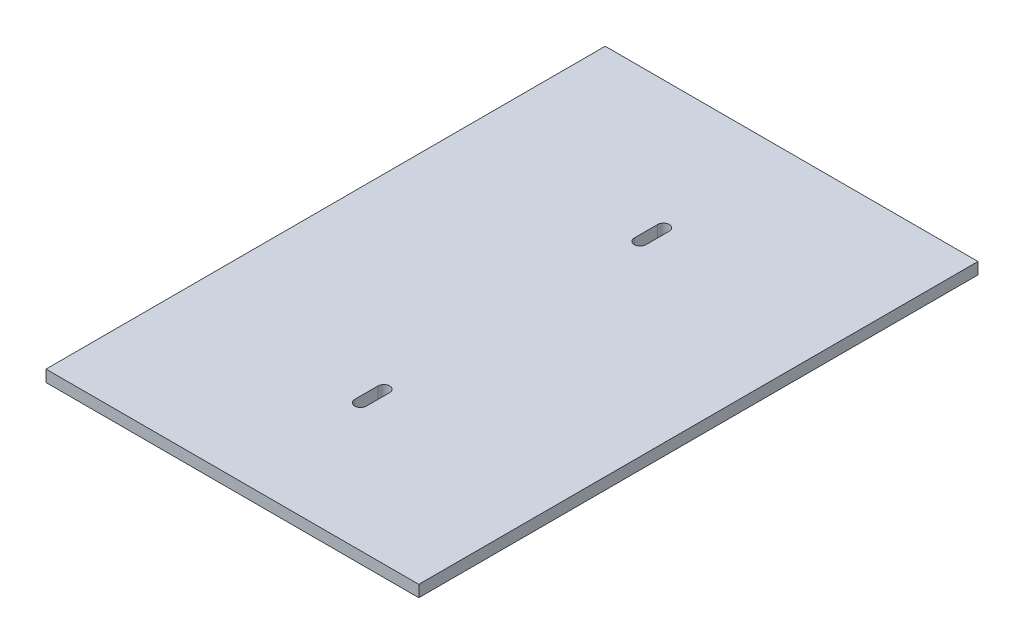
ISO-10303-21;
HEADER;
FILE_DESCRIPTION(('STEP AP214'),'2;1');
FILE_NAME('part.step','',(''),(''),'','','');
FILE_SCHEMA(('AUTOMOTIVE_DESIGN { 1 0 10303 214 1 1 1 1 }'));
ENDSEC;
DATA;
#1=APPLICATION_CONTEXT('core data for automotive mechanical design processes');
#2=APPLICATION_PROTOCOL_DEFINITION('international standard','automotive_design',2000,#1);
#3=PRODUCT_CONTEXT('',#1,'mechanical');
#4=PRODUCT('Part','Part','',(#3));
#5=PRODUCT_RELATED_PRODUCT_CATEGORY('part','',(#4));
#6=PRODUCT_DEFINITION_FORMATION('','',#4);
#7=PRODUCT_DEFINITION_CONTEXT('part definition',#1,'design');
#8=PRODUCT_DEFINITION('design','',#6,#7);
#9=PRODUCT_DEFINITION_SHAPE('','',#8);
#10=(LENGTH_UNIT() NAMED_UNIT(*) SI_UNIT(.MILLI.,.METRE.));
#11=(NAMED_UNIT(*) PLANE_ANGLE_UNIT() SI_UNIT($,.RADIAN.));
#12=(NAMED_UNIT(*) SI_UNIT($,.STERADIAN.) SOLID_ANGLE_UNIT());
#13=UNCERTAINTY_MEASURE_WITH_UNIT(LENGTH_MEASURE(1.E-05),#10,'distance_accuracy_value','');
#14=(GEOMETRIC_REPRESENTATION_CONTEXT(3) GLOBAL_UNCERTAINTY_ASSIGNED_CONTEXT((#13)) GLOBAL_UNIT_ASSIGNED_CONTEXT((#10,
#11,#12)) REPRESENTATION_CONTEXT('',''));
#15=CARTESIAN_POINT('',(0.,0.,0.));
#16=DIRECTION('',(0.,0.,1.));
#17=DIRECTION('',(1.,0.,0.));
#18=AXIS2_PLACEMENT_3D('',#15,#16,#17);
#19=CARTESIAN_POINT('',(0.,6.35,0.));
#20=DIRECTION('',(0.,-1.,0.));
#21=DIRECTION('',(0.,0.,-1.));
#22=AXIS2_PLACEMENT_3D('',#19,#20,#21);
#23=PLANE('',#22);
#24=CARTESIAN_POINT('',(0.,6.35,69.85));
#25=DIRECTION('',(0.,1.,0.));
#26=DIRECTION('',(0.,0.,1.));
#27=AXIS2_PLACEMENT_3D('',#24,#25,#26);
#28=CIRCLE('',#27,3.17500000000003);
#29=CARTESIAN_POINT('',(3.17500000000001,6.35,69.85));
#30=VERTEX_POINT('',#29);
#31=CARTESIAN_POINT('',(-3.17500000000005,6.35,69.85));
#32=VERTEX_POINT('',#31);
#33=EDGE_CURVE('E164',#30,#32,#28,.T.);
#34=ORIENTED_EDGE('',*,*,#33,.F.);
#35=DIRECTION('',(0.,0.,-1.));
#36=VECTOR('',#35,1.);
#37=CARTESIAN_POINT('',(3.17500000000001,6.35,69.85));
#38=LINE('',#37,#36);
#39=CARTESIAN_POINT('',(3.17500000000002,6.35,82.55));
#40=VERTEX_POINT('',#39);
#41=EDGE_CURVE('E172',#40,#30,#38,.T.);
#42=ORIENTED_EDGE('',*,*,#41,.F.);
#43=CARTESIAN_POINT('',(0.,6.35,82.55));
#44=DIRECTION('',(0.,1.,0.));
#45=DIRECTION('',(0.,0.,1.));
#46=AXIS2_PLACEMENT_3D('',#43,#44,#45);
#47=CIRCLE('',#46,3.17500000000003);
#48=CARTESIAN_POINT('',(-3.17500000000003,6.35,82.55));
#49=VERTEX_POINT('',#48);
#50=EDGE_CURVE('E169',#49,#40,#47,.T.);
#51=ORIENTED_EDGE('',*,*,#50,.F.);
#52=DIRECTION('',(0.,0.,1.));
#53=VECTOR('',#52,1.);
#54=CARTESIAN_POINT('',(-3.17500000000005,6.35,69.85));
#55=LINE('',#54,#53);
#56=EDGE_CURVE('E166',#32,#49,#55,.T.);
#57=ORIENTED_EDGE('',*,*,#56,.F.);
#58=EDGE_LOOP('',(#34,#42,#51,#57));
#59=FACE_BOUND('',#58,.T.);
#60=DIRECTION('',(0.,0.,-1.));
#61=VECTOR('',#60,1.);
#62=CARTESIAN_POINT('',(101.6,6.35,152.4));
#63=LINE('',#62,#61);
#64=CARTESIAN_POINT('',(101.6,6.35,152.4));
#65=VERTEX_POINT('',#64);
#66=CARTESIAN_POINT('',(101.6,6.35,-152.4));
#67=VERTEX_POINT('',#66);
#68=EDGE_CURVE('E195',#65,#67,#63,.T.);
#69=ORIENTED_EDGE('',*,*,#68,.T.);
#70=DIRECTION('',(-1.,0.,0.));
#71=VECTOR('',#70,1.);
#72=CARTESIAN_POINT('',(-101.6,6.35,-152.4));
#73=LINE('',#72,#71);
#74=CARTESIAN_POINT('',(-101.6,6.35,-152.4));
#75=VERTEX_POINT('',#74);
#76=EDGE_CURVE('E198',#67,#75,#73,.T.);
#77=ORIENTED_EDGE('',*,*,#76,.T.);
#78=DIRECTION('',(0.,0.,1.));
#79=VECTOR('',#78,1.);
#80=CARTESIAN_POINT('',(-101.6,6.35,152.4));
#81=LINE('',#80,#79);
#82=CARTESIAN_POINT('',(-101.6,6.35,152.4));
#83=VERTEX_POINT('',#82);
#84=EDGE_CURVE('E201',#75,#83,#81,.T.);
#85=ORIENTED_EDGE('',*,*,#84,.T.);
#86=DIRECTION('',(1.,0.,0.));
#87=VECTOR('',#86,1.);
#88=CARTESIAN_POINT('',(-101.6,6.35,152.4));
#89=LINE('',#88,#87);
#90=EDGE_CURVE('E203',#83,#65,#89,.T.);
#91=ORIENTED_EDGE('',*,*,#90,.T.);
#92=EDGE_LOOP('',(#69,#77,#85,#91));
#93=FACE_BOUND('',#92,.T.);
#94=CARTESIAN_POINT('',(0.,6.35,-69.85));
#95=DIRECTION('',(0.,1.,0.));
#96=DIRECTION('',(0.,0.,-1.));
#97=AXIS2_PLACEMENT_3D('',#94,#95,#96);
#98=CIRCLE('',#97,3.17500000000003);
#99=CARTESIAN_POINT('',(-3.17500000000005,6.35,-69.85));
#100=VERTEX_POINT('',#99);
#101=CARTESIAN_POINT('',(3.17500000000001,6.35,-69.85));
#102=VERTEX_POINT('',#101);
#103=EDGE_CURVE('E128',#100,#102,#98,.T.);
#104=ORIENTED_EDGE('',*,*,#103,.F.);
#105=DIRECTION('',(0.,0.,1.));
#106=VECTOR('',#105,1.);
#107=CARTESIAN_POINT('',(-3.17500000000005,6.35,-69.85));
#108=LINE('',#107,#106);
#109=CARTESIAN_POINT('',(-3.17500000000004,6.35,-82.55));
#110=VERTEX_POINT('',#109);
#111=EDGE_CURVE('E150',#110,#100,#108,.T.);
#112=ORIENTED_EDGE('',*,*,#111,.F.);
#113=CARTESIAN_POINT('',(0.,6.35,-82.55));
#114=DIRECTION('',(0.,1.,0.));
#115=DIRECTION('',(0.,0.,-1.));
#116=AXIS2_PLACEMENT_3D('',#113,#114,#115);
#117=CIRCLE('',#116,3.17500000000003);
#118=CARTESIAN_POINT('',(3.17500000000002,6.35,-82.55));
#119=VERTEX_POINT('',#118);
#120=EDGE_CURVE('E148',#119,#110,#117,.T.);
#121=ORIENTED_EDGE('',*,*,#120,.F.);
#122=DIRECTION('',(0.,0.,-1.));
#123=VECTOR('',#122,1.);
#124=CARTESIAN_POINT('',(3.17500000000001,6.35,-69.85));
#125=LINE('',#124,#123);
#126=EDGE_CURVE('E136',#102,#119,#125,.T.);
#127=ORIENTED_EDGE('',*,*,#126,.F.);
#128=EDGE_LOOP('',(#104,#112,#121,#127));
#129=FACE_BOUND('',#128,.T.);
#130=ADVANCED_FACE('F39',(#59,#93,#129),#23,.F.);
#131=CARTESIAN_POINT('',(0.,0.,0.));
#132=DIRECTION('',(0.,-1.,0.));
#133=DIRECTION('',(0.,0.,-1.));
#134=AXIS2_PLACEMENT_3D('',#131,#132,#133);
#135=PLANE('',#134);
#136=DIRECTION('',(0.,0.,-1.));
#137=VECTOR('',#136,1.);
#138=CARTESIAN_POINT('',(101.6,0.,152.4));
#139=LINE('',#138,#137);
#140=CARTESIAN_POINT('',(101.6,0.,152.4));
#141=VERTEX_POINT('',#140);
#142=CARTESIAN_POINT('',(101.6,0.,-152.4));
#143=VERTEX_POINT('',#142);
#144=EDGE_CURVE('E194',#141,#143,#139,.T.);
#145=ORIENTED_EDGE('',*,*,#144,.F.);
#146=DIRECTION('',(1.,0.,0.));
#147=VECTOR('',#146,1.);
#148=CARTESIAN_POINT('',(-101.6,0.,152.4));
#149=LINE('',#148,#147);
#150=CARTESIAN_POINT('',(-101.6,0.,152.4));
#151=VERTEX_POINT('',#150);
#152=EDGE_CURVE('E199',#151,#141,#149,.T.);
#153=ORIENTED_EDGE('',*,*,#152,.F.);
#154=DIRECTION('',(0.,0.,1.));
#155=VECTOR('',#154,1.);
#156=CARTESIAN_POINT('',(-101.6,0.,152.4));
#157=LINE('',#156,#155);
#158=CARTESIAN_POINT('',(-101.6,0.,-152.4));
#159=VERTEX_POINT('',#158);
#160=EDGE_CURVE('E210',#159,#151,#157,.T.);
#161=ORIENTED_EDGE('',*,*,#160,.F.);
#162=DIRECTION('',(-1.,0.,0.));
#163=VECTOR('',#162,1.);
#164=CARTESIAN_POINT('',(-101.6,0.,-152.4));
#165=LINE('',#164,#163);
#166=EDGE_CURVE('E208',#143,#159,#165,.T.);
#167=ORIENTED_EDGE('',*,*,#166,.F.);
#168=EDGE_LOOP('',(#145,#153,#161,#167));
#169=FACE_BOUND('',#168,.T.);
#170=DIRECTION('',(0.,0.,-1.));
#171=VECTOR('',#170,1.);
#172=CARTESIAN_POINT('',(3.17500000000001,0.,69.85));
#173=LINE('',#172,#171);
#174=CARTESIAN_POINT('',(3.17500000000002,0.,82.55));
#175=VERTEX_POINT('',#174);
#176=CARTESIAN_POINT('',(3.17500000000001,0.,69.85));
#177=VERTEX_POINT('',#176);
#178=EDGE_CURVE('E167',#175,#177,#173,.T.);
#179=ORIENTED_EDGE('',*,*,#178,.T.);
#180=CARTESIAN_POINT('',(0.,0.,69.85));
#181=DIRECTION('',(0.,1.,0.));
#182=DIRECTION('',(0.,0.,1.));
#183=AXIS2_PLACEMENT_3D('',#180,#181,#182);
#184=CIRCLE('',#183,3.17500000000003);
#185=CARTESIAN_POINT('',(-3.17500000000005,0.,69.85));
#186=VERTEX_POINT('',#185);
#187=EDGE_CURVE('E144',#177,#186,#184,.T.);
#188=ORIENTED_EDGE('',*,*,#187,.T.);
#189=DIRECTION('',(0.,0.,1.));
#190=VECTOR('',#189,1.);
#191=CARTESIAN_POINT('',(-3.17500000000005,0.,69.85));
#192=LINE('',#191,#190);
#193=CARTESIAN_POINT('',(-3.17500000000003,0.,82.55));
#194=VERTEX_POINT('',#193);
#195=EDGE_CURVE('E177',#186,#194,#192,.T.);
#196=ORIENTED_EDGE('',*,*,#195,.T.);
#197=CARTESIAN_POINT('',(0.,0.,82.55));
#198=DIRECTION('',(0.,1.,0.));
#199=DIRECTION('',(0.,0.,1.));
#200=AXIS2_PLACEMENT_3D('',#197,#198,#199);
#201=CIRCLE('',#200,3.17500000000003);
#202=EDGE_CURVE('E180',#194,#175,#201,.T.);
#203=ORIENTED_EDGE('',*,*,#202,.T.);
#204=EDGE_LOOP('',(#179,#188,#196,#203));
#205=FACE_BOUND('',#204,.T.);
#206=DIRECTION('',(0.,0.,1.));
#207=VECTOR('',#206,1.);
#208=CARTESIAN_POINT('',(-3.17500000000005,0.,-69.85));
#209=LINE('',#208,#207);
#210=CARTESIAN_POINT('',(-3.17500000000003,0.,-82.55));
#211=VERTEX_POINT('',#210);
#212=CARTESIAN_POINT('',(-3.17500000000005,0.,-69.85));
#213=VERTEX_POINT('',#212);
#214=EDGE_CURVE('E137',#211,#213,#209,.T.);
#215=ORIENTED_EDGE('',*,*,#214,.T.);
#216=CARTESIAN_POINT('',(0.,0.,-69.85));
#217=DIRECTION('',(0.,1.,0.));
#218=DIRECTION('',(0.,0.,-1.));
#219=AXIS2_PLACEMENT_3D('',#216,#217,#218);
#220=CIRCLE('',#219,3.17500000000003);
#221=CARTESIAN_POINT('',(3.17500000000001,0.,-69.85));
#222=VERTEX_POINT('',#221);
#223=EDGE_CURVE('E62',#213,#222,#220,.T.);
#224=ORIENTED_EDGE('',*,*,#223,.T.);
#225=DIRECTION('',(0.,0.,-1.));
#226=VECTOR('',#225,1.);
#227=CARTESIAN_POINT('',(3.17500000000001,0.,-69.85));
#228=LINE('',#227,#226);
#229=CARTESIAN_POINT('',(3.17500000000002,0.,-82.55));
#230=VERTEX_POINT('',#229);
#231=EDGE_CURVE('E143',#222,#230,#228,.T.);
#232=ORIENTED_EDGE('',*,*,#231,.T.);
#233=CARTESIAN_POINT('',(0.,0.,-82.55));
#234=DIRECTION('',(0.,1.,0.));
#235=DIRECTION('',(0.,0.,-1.));
#236=AXIS2_PLACEMENT_3D('',#233,#234,#235);
#237=CIRCLE('',#236,3.17500000000003);
#238=EDGE_CURVE('E156',#230,#211,#237,.T.);
#239=ORIENTED_EDGE('',*,*,#238,.T.);
#240=EDGE_LOOP('',(#215,#224,#232,#239));
#241=FACE_BOUND('',#240,.T.);
#242=ADVANCED_FACE('F228',(#169,#205,#241),#135,.T.);
#243=CARTESIAN_POINT('',(101.6,6.35,152.4));
#244=DIRECTION('',(-1.,0.,0.));
#245=DIRECTION('',(0.,0.,1.));
#246=AXIS2_PLACEMENT_3D('',#243,#244,#245);
#247=PLANE('',#246);
#248=ORIENTED_EDGE('',*,*,#144,.T.);
#249=DIRECTION('',(0.,-1.,0.));
#250=VECTOR('',#249,1.);
#251=CARTESIAN_POINT('',(101.6,6.35,-152.4));
#252=LINE('',#251,#250);
#253=EDGE_CURVE('E11',#67,#143,#252,.T.);
#254=ORIENTED_EDGE('',*,*,#253,.F.);
#255=ORIENTED_EDGE('',*,*,#68,.F.);
#256=DIRECTION('',(0.,-1.,0.));
#257=VECTOR('',#256,1.);
#258=CARTESIAN_POINT('',(101.6,6.35,152.4));
#259=LINE('',#258,#257);
#260=EDGE_CURVE('E205',#65,#141,#259,.T.);
#261=ORIENTED_EDGE('',*,*,#260,.T.);
#262=EDGE_LOOP('',(#248,#254,#255,#261));
#263=FACE_BOUND('',#262,.T.);
#264=ADVANCED_FACE('F41',(#263),#247,.F.);
#265=CARTESIAN_POINT('',(-101.6,6.35,-152.4));
#266=DIRECTION('',(0.,0.,1.));
#267=DIRECTION('',(1.,0.,0.));
#268=AXIS2_PLACEMENT_3D('',#265,#266,#267);
#269=PLANE('',#268);
#270=ORIENTED_EDGE('',*,*,#166,.T.);
#271=DIRECTION('',(0.,-1.,0.));
#272=VECTOR('',#271,1.);
#273=CARTESIAN_POINT('',(-101.6,6.35,-152.4));
#274=LINE('',#273,#272);
#275=EDGE_CURVE('E47',#75,#159,#274,.T.);
#276=ORIENTED_EDGE('',*,*,#275,.F.);
#277=ORIENTED_EDGE('',*,*,#76,.F.);
#278=ORIENTED_EDGE('',*,*,#253,.T.);
#279=EDGE_LOOP('',(#270,#276,#277,#278));
#280=FACE_BOUND('',#279,.T.);
#281=ADVANCED_FACE('F238',(#280),#269,.F.);
#282=CARTESIAN_POINT('',(-101.6,6.35,152.4));
#283=DIRECTION('',(1.,0.,0.));
#284=DIRECTION('',(0.,0.,-1.));
#285=AXIS2_PLACEMENT_3D('',#282,#283,#284);
#286=PLANE('',#285);
#287=ORIENTED_EDGE('',*,*,#160,.T.);
#288=DIRECTION('',(0.,-1.,0.));
#289=VECTOR('',#288,1.);
#290=CARTESIAN_POINT('',(-101.6,6.35,152.4));
#291=LINE('',#290,#289);
#292=EDGE_CURVE('E215',#83,#151,#291,.T.);
#293=ORIENTED_EDGE('',*,*,#292,.F.);
#294=ORIENTED_EDGE('',*,*,#84,.F.);
#295=ORIENTED_EDGE('',*,*,#275,.T.);
#296=EDGE_LOOP('',(#287,#293,#294,#295));
#297=FACE_BOUND('',#296,.T.);
#298=ADVANCED_FACE('F222',(#297),#286,.F.);
#299=CARTESIAN_POINT('',(-101.6,6.35,152.4));
#300=DIRECTION('',(0.,0.,-1.));
#301=DIRECTION('',(-1.,0.,0.));
#302=AXIS2_PLACEMENT_3D('',#299,#300,#301);
#303=PLANE('',#302);
#304=ORIENTED_EDGE('',*,*,#152,.T.);
#305=ORIENTED_EDGE('',*,*,#260,.F.);
#306=ORIENTED_EDGE('',*,*,#90,.F.);
#307=ORIENTED_EDGE('',*,*,#292,.T.);
#308=EDGE_LOOP('',(#304,#305,#306,#307));
#309=FACE_BOUND('',#308,.T.);
#310=ADVANCED_FACE('F232',(#309),#303,.F.);
#311=CARTESIAN_POINT('',(0.,6.35,69.85));
#312=DIRECTION('',(0.,-1.,0.));
#313=DIRECTION('',(0.,0.,-1.));
#314=AXIS2_PLACEMENT_3D('',#311,#312,#313);
#315=CYLINDRICAL_SURFACE('',#314,3.17500000000003);
#316=ORIENTED_EDGE('',*,*,#187,.F.);
#317=DIRECTION('',(0.,-1.,0.));
#318=VECTOR('',#317,1.);
#319=CARTESIAN_POINT('',(3.17500000000001,6.35,69.85));
#320=LINE('',#319,#318);
#321=EDGE_CURVE('E174',#30,#177,#320,.T.);
#322=ORIENTED_EDGE('',*,*,#321,.F.);
#323=ORIENTED_EDGE('',*,*,#33,.T.);
#324=DIRECTION('',(0.,-1.,0.));
#325=VECTOR('',#324,1.);
#326=CARTESIAN_POINT('',(-3.17500000000005,6.35,69.85));
#327=LINE('',#326,#325);
#328=EDGE_CURVE('E191',#32,#186,#327,.T.);
#329=ORIENTED_EDGE('',*,*,#328,.T.);
#330=EDGE_LOOP('',(#316,#322,#323,#329));
#331=FACE_BOUND('',#330,.T.);
#332=ADVANCED_FACE('F254',(#331),#315,.F.);
#333=CARTESIAN_POINT('',(-3.17500000000005,6.35,69.85));
#334=DIRECTION('',(1.,0.,0.));
#335=DIRECTION('',(0.,0.,-1.));
#336=AXIS2_PLACEMENT_3D('',#333,#334,#335);
#337=PLANE('',#336);
#338=ORIENTED_EDGE('',*,*,#195,.F.);
#339=ORIENTED_EDGE('',*,*,#328,.F.);
#340=ORIENTED_EDGE('',*,*,#56,.T.);
#341=DIRECTION('',(0.,-1.,0.));
#342=VECTOR('',#341,1.);
#343=CARTESIAN_POINT('',(-3.17500000000003,6.35,82.55));
#344=LINE('',#343,#342);
#345=EDGE_CURVE('E189',#49,#194,#344,.T.);
#346=ORIENTED_EDGE('',*,*,#345,.T.);
#347=EDGE_LOOP('',(#338,#339,#340,#346));
#348=FACE_BOUND('',#347,.T.);
#349=ADVANCED_FACE('F261',(#348),#337,.T.);
#350=CARTESIAN_POINT('',(0.,6.35,82.55));
#351=DIRECTION('',(0.,-1.,0.));
#352=DIRECTION('',(0.,0.,-1.));
#353=AXIS2_PLACEMENT_3D('',#350,#351,#352);
#354=CYLINDRICAL_SURFACE('',#353,3.17500000000003);
#355=ORIENTED_EDGE('',*,*,#202,.F.);
#356=ORIENTED_EDGE('',*,*,#345,.F.);
#357=ORIENTED_EDGE('',*,*,#50,.T.);
#358=DIRECTION('',(0.,-1.,0.));
#359=VECTOR('',#358,1.);
#360=CARTESIAN_POINT('',(3.17500000000002,6.35,82.55));
#361=LINE('',#360,#359);
#362=EDGE_CURVE('E187',#40,#175,#361,.T.);
#363=ORIENTED_EDGE('',*,*,#362,.T.);
#364=EDGE_LOOP('',(#355,#356,#357,#363));
#365=FACE_BOUND('',#364,.T.);
#366=ADVANCED_FACE('F266',(#365),#354,.F.);
#367=CARTESIAN_POINT('',(3.17500000000001,6.35,69.85));
#368=DIRECTION('',(-1.,0.,0.));
#369=DIRECTION('',(0.,0.,1.));
#370=AXIS2_PLACEMENT_3D('',#367,#368,#369);
#371=PLANE('',#370);
#372=ORIENTED_EDGE('',*,*,#178,.F.);
#373=ORIENTED_EDGE('',*,*,#362,.F.);
#374=ORIENTED_EDGE('',*,*,#41,.T.);
#375=ORIENTED_EDGE('',*,*,#321,.T.);
#376=EDGE_LOOP('',(#372,#373,#374,#375));
#377=FACE_BOUND('',#376,.T.);
#378=ADVANCED_FACE('F272',(#377),#371,.T.);
#379=CARTESIAN_POINT('',(0.,6.35,-69.85));
#380=DIRECTION('',(0.,-1.,0.));
#381=DIRECTION('',(0.,0.,-1.));
#382=AXIS2_PLACEMENT_3D('',#379,#380,#381);
#383=CYLINDRICAL_SURFACE('',#382,3.17500000000003);
#384=ORIENTED_EDGE('',*,*,#223,.F.);
#385=DIRECTION('',(0.,-1.,0.));
#386=VECTOR('',#385,1.);
#387=CARTESIAN_POINT('',(-3.17500000000005,6.35,-69.85));
#388=LINE('',#387,#386);
#389=EDGE_CURVE('E132',#100,#213,#388,.T.);
#390=ORIENTED_EDGE('',*,*,#389,.F.);
#391=ORIENTED_EDGE('',*,*,#103,.T.);
#392=DIRECTION('',(0.,-1.,0.));
#393=VECTOR('',#392,1.);
#394=CARTESIAN_POINT('',(3.17500000000001,6.35,-69.85));
#395=LINE('',#394,#393);
#396=EDGE_CURVE('E131',#102,#222,#395,.T.);
#397=ORIENTED_EDGE('',*,*,#396,.T.);
#398=EDGE_LOOP('',(#384,#390,#391,#397));
#399=FACE_BOUND('',#398,.T.);
#400=ADVANCED_FACE('F130',(#399),#383,.F.);
#401=CARTESIAN_POINT('',(3.17500000000001,6.35,-69.85));
#402=DIRECTION('',(-1.,0.,0.));
#403=DIRECTION('',(0.,0.,1.));
#404=AXIS2_PLACEMENT_3D('',#401,#402,#403);
#405=PLANE('',#404);
#406=ORIENTED_EDGE('',*,*,#231,.F.);
#407=ORIENTED_EDGE('',*,*,#396,.F.);
#408=ORIENTED_EDGE('',*,*,#126,.T.);
#409=DIRECTION('',(0.,-1.,0.));
#410=VECTOR('',#409,1.);
#411=CARTESIAN_POINT('',(3.17500000000002,6.35,-82.55));
#412=LINE('',#411,#410);
#413=EDGE_CURVE('E145',#119,#230,#412,.T.);
#414=ORIENTED_EDGE('',*,*,#413,.T.);
#415=EDGE_LOOP('',(#406,#407,#408,#414));
#416=FACE_BOUND('',#415,.T.);
#417=ADVANCED_FACE('F140',(#416),#405,.T.);
#418=CARTESIAN_POINT('',(0.,6.35,-82.55));
#419=DIRECTION('',(0.,-1.,0.));
#420=DIRECTION('',(0.,0.,-1.));
#421=AXIS2_PLACEMENT_3D('',#418,#419,#420);
#422=CYLINDRICAL_SURFACE('',#421,3.17500000000003);
#423=ORIENTED_EDGE('',*,*,#238,.F.);
#424=ORIENTED_EDGE('',*,*,#413,.F.);
#425=ORIENTED_EDGE('',*,*,#120,.T.);
#426=DIRECTION('',(0.,-1.,0.));
#427=VECTOR('',#426,1.);
#428=CARTESIAN_POINT('',(-3.17500000000003,6.35,-82.55));
#429=LINE('',#428,#427);
#430=EDGE_CURVE('E54',#110,#211,#429,.T.);
#431=ORIENTED_EDGE('',*,*,#430,.T.);
#432=EDGE_LOOP('',(#423,#424,#425,#431));
#433=FACE_BOUND('',#432,.T.);
#434=ADVANCED_FACE('F291',(#433),#422,.F.);
#435=CARTESIAN_POINT('',(-3.17500000000005,6.35,-69.85));
#436=DIRECTION('',(1.,0.,0.));
#437=DIRECTION('',(0.,0.,-1.));
#438=AXIS2_PLACEMENT_3D('',#435,#436,#437);
#439=PLANE('',#438);
#440=ORIENTED_EDGE('',*,*,#214,.F.);
#441=ORIENTED_EDGE('',*,*,#430,.F.);
#442=ORIENTED_EDGE('',*,*,#111,.T.);
#443=ORIENTED_EDGE('',*,*,#389,.T.);
#444=EDGE_LOOP('',(#440,#441,#442,#443));
#445=FACE_BOUND('',#444,.T.);
#446=ADVANCED_FACE('F294',(#445),#439,.T.);
#447=CLOSED_SHELL('',(#130,#242,#264,#281,#298,#310,#332,#349,#366,#378,#400,#417,#434,#446));
#448=MANIFOLD_SOLID_BREP('B2',#447);
#449=ADVANCED_BREP_SHAPE_REPRESENTATION('',(#18,#448),#14);
#450=SHAPE_DEFINITION_REPRESENTATION(#9,#449);
ENDSEC;
END-ISO-10303-21;
